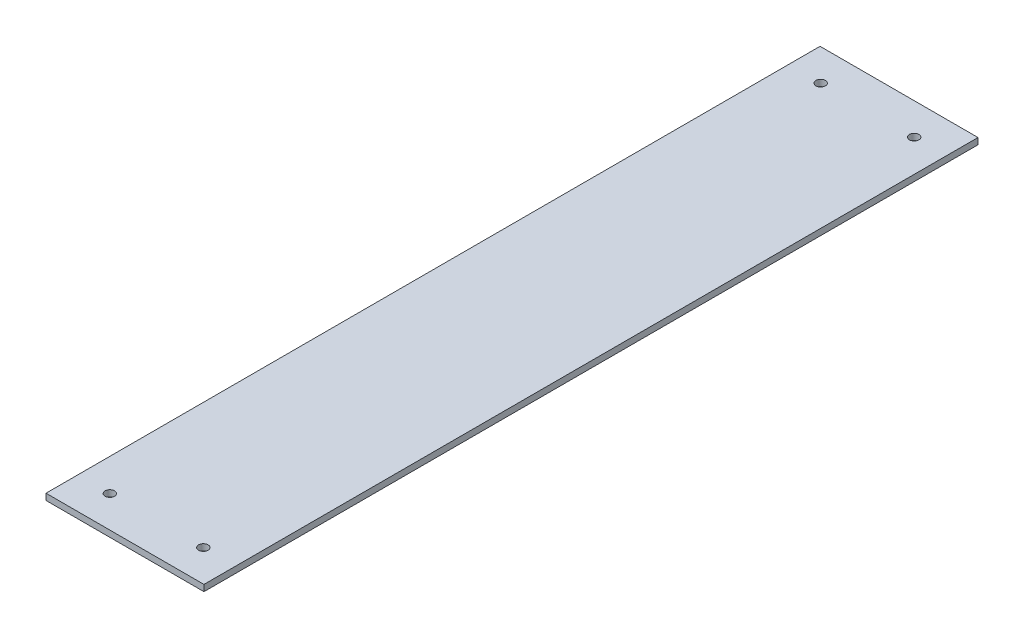
ISO-10303-21;
HEADER;
FILE_DESCRIPTION(('STEP AP214'),'2;1');
FILE_NAME('part.step','',(''),(''),'','','');
FILE_SCHEMA(('AUTOMOTIVE_DESIGN { 1 0 10303 214 1 1 1 1 }'));
ENDSEC;
DATA;
#1=APPLICATION_CONTEXT('core data for automotive mechanical design processes');
#2=APPLICATION_PROTOCOL_DEFINITION('international standard','automotive_design',2000,#1);
#3=PRODUCT_CONTEXT('',#1,'mechanical');
#4=PRODUCT('Part','Part','',(#3));
#5=PRODUCT_RELATED_PRODUCT_CATEGORY('part','',(#4));
#6=PRODUCT_DEFINITION_FORMATION('','',#4);
#7=PRODUCT_DEFINITION_CONTEXT('part definition',#1,'design');
#8=PRODUCT_DEFINITION('design','',#6,#7);
#9=PRODUCT_DEFINITION_SHAPE('','',#8);
#10=(LENGTH_UNIT() NAMED_UNIT(*) SI_UNIT(.MILLI.,.METRE.));
#11=(NAMED_UNIT(*) PLANE_ANGLE_UNIT() SI_UNIT($,.RADIAN.));
#12=(NAMED_UNIT(*) SI_UNIT($,.STERADIAN.) SOLID_ANGLE_UNIT());
#13=UNCERTAINTY_MEASURE_WITH_UNIT(LENGTH_MEASURE(1.E-05),#10,'distance_accuracy_value','');
#14=(GEOMETRIC_REPRESENTATION_CONTEXT(3) GLOBAL_UNCERTAINTY_ASSIGNED_CONTEXT((#13)) GLOBAL_UNIT_ASSIGNED_CONTEXT((#10,
#11,#12)) REPRESENTATION_CONTEXT('',''));
#15=CARTESIAN_POINT('',(0.,0.,0.));
#16=DIRECTION('',(0.,0.,1.));
#17=DIRECTION('',(1.,0.,0.));
#18=AXIS2_PLACEMENT_3D('',#15,#16,#17);
#19=CARTESIAN_POINT('',(0.,2.,0.));
#20=DIRECTION('',(0.,-1.,0.));
#21=DIRECTION('',(0.,0.,-1.));
#22=AXIS2_PLACEMENT_3D('',#19,#20,#21);
#23=PLANE('',#22);
#24=DIRECTION('',(0.,0.,1.));
#25=VECTOR('',#24,1.);
#26=CARTESIAN_POINT('',(0.,2.,0.));
#27=LINE('',#26,#25);
#28=CARTESIAN_POINT('',(0.,2.,-245.));
#29=VERTEX_POINT('',#28);
#30=CARTESIAN_POINT('',(0.,2.,0.));
#31=VERTEX_POINT('',#30);
#32=EDGE_CURVE('E88',#29,#31,#27,.T.);
#33=ORIENTED_EDGE('',*,*,#32,.T.);
#34=DIRECTION('',(1.,0.,0.));
#35=VECTOR('',#34,1.);
#36=CARTESIAN_POINT('',(0.,2.,0.));
#37=LINE('',#36,#35);
#38=CARTESIAN_POINT('',(50.,2.,0.));
#39=VERTEX_POINT('',#38);
#40=EDGE_CURVE('E83',#31,#39,#37,.T.);
#41=ORIENTED_EDGE('',*,*,#40,.T.);
#42=DIRECTION('',(0.,0.,-1.));
#43=VECTOR('',#42,1.);
#44=CARTESIAN_POINT('',(50.,2.,0.));
#45=LINE('',#44,#43);
#46=CARTESIAN_POINT('',(50.,2.,-245.));
#47=VERTEX_POINT('',#46);
#48=EDGE_CURVE('E86',#39,#47,#45,.T.);
#49=ORIENTED_EDGE('',*,*,#48,.T.);
#50=DIRECTION('',(-1.,0.,0.));
#51=VECTOR('',#50,1.);
#52=CARTESIAN_POINT('',(0.,2.,-245.));
#53=LINE('',#52,#51);
#54=EDGE_CURVE('E53',#47,#29,#53,.T.);
#55=ORIENTED_EDGE('',*,*,#54,.T.);
#56=EDGE_LOOP('',(#33,#41,#49,#55));
#57=FACE_BOUND('',#56,.T.);
#58=CARTESIAN_POINT('',(39.8,2.,-10.));
#59=DIRECTION('',(0.,1.,0.));
#60=DIRECTION('',(0.,0.,1.));
#61=AXIS2_PLACEMENT_3D('',#58,#59,#60);
#62=CIRCLE('',#61,1.5);
#63=CARTESIAN_POINT('',(39.8,2.,-8.5));
#64=VERTEX_POINT('',#63);
#65=EDGE_CURVE('E103',#64,#64,#62,.T.);
#66=ORIENTED_EDGE('',*,*,#65,.F.);
#67=EDGE_LOOP('',(#66));
#68=FACE_BOUND('',#67,.T.);
#69=CARTESIAN_POINT('',(10.2,2.,-10.));
#70=DIRECTION('',(0.,1.,0.));
#71=DIRECTION('',(0.,0.,1.));
#72=AXIS2_PLACEMENT_3D('',#69,#70,#71);
#73=CIRCLE('',#72,1.5);
#74=CARTESIAN_POINT('',(10.2,2.,-8.5));
#75=VERTEX_POINT('',#74);
#76=EDGE_CURVE('E118',#75,#75,#73,.T.);
#77=ORIENTED_EDGE('',*,*,#76,.F.);
#78=EDGE_LOOP('',(#77));
#79=FACE_BOUND('',#78,.T.);
#80=CARTESIAN_POINT('',(39.8,2.,-235.));
#81=DIRECTION('',(0.,1.,0.));
#82=DIRECTION('',(0.,0.,-1.));
#83=AXIS2_PLACEMENT_3D('',#80,#81,#82);
#84=CIRCLE('',#83,1.49999999999999);
#85=CARTESIAN_POINT('',(39.8,2.,-236.5));
#86=VERTEX_POINT('',#85);
#87=EDGE_CURVE('E124',#86,#86,#84,.T.);
#88=ORIENTED_EDGE('',*,*,#87,.F.);
#89=EDGE_LOOP('',(#88));
#90=FACE_BOUND('',#89,.T.);
#91=CARTESIAN_POINT('',(10.2,2.,-235.));
#92=DIRECTION('',(0.,1.,0.));
#93=DIRECTION('',(0.,0.,-1.));
#94=AXIS2_PLACEMENT_3D('',#91,#92,#93);
#95=CIRCLE('',#94,1.5);
#96=CARTESIAN_POINT('',(10.2,2.,-236.5));
#97=VERTEX_POINT('',#96);
#98=EDGE_CURVE('E130',#97,#97,#95,.T.);
#99=ORIENTED_EDGE('',*,*,#98,.F.);
#100=EDGE_LOOP('',(#99));
#101=FACE_BOUND('',#100,.T.);
#102=ADVANCED_FACE('F36',(#57,#68,#79,#90,#101),#23,.F.);
#103=CARTESIAN_POINT('',(0.,0.,0.));
#104=DIRECTION('',(0.,-1.,0.));
#105=DIRECTION('',(0.,0.,-1.));
#106=AXIS2_PLACEMENT_3D('',#103,#104,#105);
#107=PLANE('',#106);
#108=CARTESIAN_POINT('',(39.8,0.,-235.));
#109=DIRECTION('',(0.,1.,0.));
#110=DIRECTION('',(0.,0.,-1.));
#111=AXIS2_PLACEMENT_3D('',#108,#109,#110);
#112=CIRCLE('',#111,1.49999999999999);
#113=CARTESIAN_POINT('',(39.8,0.,-236.5));
#114=VERTEX_POINT('',#113);
#115=EDGE_CURVE('E127',#114,#114,#112,.T.);
#116=ORIENTED_EDGE('',*,*,#115,.T.);
#117=EDGE_LOOP('',(#116));
#118=FACE_BOUND('',#117,.T.);
#119=CARTESIAN_POINT('',(39.8,0.,-10.));
#120=DIRECTION('',(0.,1.,0.));
#121=DIRECTION('',(0.,0.,1.));
#122=AXIS2_PLACEMENT_3D('',#119,#120,#121);
#123=CIRCLE('',#122,1.5);
#124=CARTESIAN_POINT('',(39.8,0.,-8.5));
#125=VERTEX_POINT('',#124);
#126=EDGE_CURVE('E115',#125,#125,#123,.T.);
#127=ORIENTED_EDGE('',*,*,#126,.T.);
#128=EDGE_LOOP('',(#127));
#129=FACE_BOUND('',#128,.T.);
#130=DIRECTION('',(0.,0.,1.));
#131=VECTOR('',#130,1.);
#132=CARTESIAN_POINT('',(0.,0.,0.));
#133=LINE('',#132,#131);
#134=CARTESIAN_POINT('',(0.,0.,-245.));
#135=VERTEX_POINT('',#134);
#136=CARTESIAN_POINT('',(0.,0.,0.));
#137=VERTEX_POINT('',#136);
#138=EDGE_CURVE('E100',#135,#137,#133,.T.);
#139=ORIENTED_EDGE('',*,*,#138,.F.);
#140=DIRECTION('',(-1.,0.,0.));
#141=VECTOR('',#140,1.);
#142=CARTESIAN_POINT('',(0.,0.,-245.));
#143=LINE('',#142,#141);
#144=CARTESIAN_POINT('',(50.,0.,-245.));
#145=VERTEX_POINT('',#144);
#146=EDGE_CURVE('E76',#145,#135,#143,.T.);
#147=ORIENTED_EDGE('',*,*,#146,.F.);
#148=DIRECTION('',(0.,0.,-1.));
#149=VECTOR('',#148,1.);
#150=CARTESIAN_POINT('',(50.,0.,0.));
#151=LINE('',#150,#149);
#152=CARTESIAN_POINT('',(50.,0.,0.));
#153=VERTEX_POINT('',#152);
#154=EDGE_CURVE('E70',#153,#145,#151,.T.);
#155=ORIENTED_EDGE('',*,*,#154,.F.);
#156=DIRECTION('',(1.,0.,0.));
#157=VECTOR('',#156,1.);
#158=CARTESIAN_POINT('',(0.,0.,0.));
#159=LINE('',#158,#157);
#160=EDGE_CURVE('E92',#137,#153,#159,.T.);
#161=ORIENTED_EDGE('',*,*,#160,.F.);
#162=EDGE_LOOP('',(#139,#147,#155,#161));
#163=FACE_BOUND('',#162,.T.);
#164=CARTESIAN_POINT('',(10.2,0.,-10.));
#165=DIRECTION('',(0.,1.,0.));
#166=DIRECTION('',(0.,0.,1.));
#167=AXIS2_PLACEMENT_3D('',#164,#165,#166);
#168=CIRCLE('',#167,1.5);
#169=CARTESIAN_POINT('',(10.2,0.,-8.5));
#170=VERTEX_POINT('',#169);
#171=EDGE_CURVE('E121',#170,#170,#168,.T.);
#172=ORIENTED_EDGE('',*,*,#171,.T.);
#173=EDGE_LOOP('',(#172));
#174=FACE_BOUND('',#173,.T.);
#175=CARTESIAN_POINT('',(10.2,0.,-235.));
#176=DIRECTION('',(0.,1.,0.));
#177=DIRECTION('',(0.,0.,-1.));
#178=AXIS2_PLACEMENT_3D('',#175,#176,#177);
#179=CIRCLE('',#178,1.5);
#180=CARTESIAN_POINT('',(10.2,0.,-236.5));
#181=VERTEX_POINT('',#180);
#182=EDGE_CURVE('E133',#181,#181,#179,.T.);
#183=ORIENTED_EDGE('',*,*,#182,.T.);
#184=EDGE_LOOP('',(#183));
#185=FACE_BOUND('',#184,.T.);
#186=ADVANCED_FACE('F111',(#118,#129,#163,#174,#185),#107,.T.);
#187=CARTESIAN_POINT('',(0.,2.,0.));
#188=DIRECTION('',(1.,0.,0.));
#189=DIRECTION('',(0.,0.,-1.));
#190=AXIS2_PLACEMENT_3D('',#187,#188,#189);
#191=PLANE('',#190);
#192=ORIENTED_EDGE('',*,*,#138,.T.);
#193=DIRECTION('',(0.,-1.,0.));
#194=VECTOR('',#193,1.);
#195=CARTESIAN_POINT('',(0.,2.,0.));
#196=LINE('',#195,#194);
#197=EDGE_CURVE('E11',#31,#137,#196,.T.);
#198=ORIENTED_EDGE('',*,*,#197,.F.);
#199=ORIENTED_EDGE('',*,*,#32,.F.);
#200=DIRECTION('',(0.,-1.,0.));
#201=VECTOR('',#200,1.);
#202=CARTESIAN_POINT('',(0.,2.,-245.));
#203=LINE('',#202,#201);
#204=EDGE_CURVE('E96',#29,#135,#203,.T.);
#205=ORIENTED_EDGE('',*,*,#204,.T.);
#206=EDGE_LOOP('',(#192,#198,#199,#205));
#207=FACE_BOUND('',#206,.T.);
#208=ADVANCED_FACE('F38',(#207),#191,.F.);
#209=CARTESIAN_POINT('',(0.,2.,0.));
#210=DIRECTION('',(0.,0.,-1.));
#211=DIRECTION('',(-1.,0.,0.));
#212=AXIS2_PLACEMENT_3D('',#209,#210,#211);
#213=PLANE('',#212);
#214=ORIENTED_EDGE('',*,*,#160,.T.);
#215=DIRECTION('',(0.,-1.,0.));
#216=VECTOR('',#215,1.);
#217=CARTESIAN_POINT('',(50.,2.,0.));
#218=LINE('',#217,#216);
#219=EDGE_CURVE('E45',#39,#153,#218,.T.);
#220=ORIENTED_EDGE('',*,*,#219,.F.);
#221=ORIENTED_EDGE('',*,*,#40,.F.);
#222=ORIENTED_EDGE('',*,*,#197,.T.);
#223=EDGE_LOOP('',(#214,#220,#221,#222));
#224=FACE_BOUND('',#223,.T.);
#225=ADVANCED_FACE('F91',(#224),#213,.F.);
#226=CARTESIAN_POINT('',(50.,2.,0.));
#227=DIRECTION('',(-1.,0.,0.));
#228=DIRECTION('',(0.,0.,1.));
#229=AXIS2_PLACEMENT_3D('',#226,#227,#228);
#230=PLANE('',#229);
#231=ORIENTED_EDGE('',*,*,#154,.T.);
#232=DIRECTION('',(0.,-1.,0.));
#233=VECTOR('',#232,1.);
#234=CARTESIAN_POINT('',(50.,2.,-245.));
#235=LINE('',#234,#233);
#236=EDGE_CURVE('E93',#47,#145,#235,.T.);
#237=ORIENTED_EDGE('',*,*,#236,.F.);
#238=ORIENTED_EDGE('',*,*,#48,.F.);
#239=ORIENTED_EDGE('',*,*,#219,.T.);
#240=EDGE_LOOP('',(#231,#237,#238,#239));
#241=FACE_BOUND('',#240,.T.);
#242=ADVANCED_FACE('F94',(#241),#230,.F.);
#243=CARTESIAN_POINT('',(0.,2.,-245.));
#244=DIRECTION('',(0.,0.,1.));
#245=DIRECTION('',(1.,0.,0.));
#246=AXIS2_PLACEMENT_3D('',#243,#244,#245);
#247=PLANE('',#246);
#248=ORIENTED_EDGE('',*,*,#146,.T.);
#249=ORIENTED_EDGE('',*,*,#204,.F.);
#250=ORIENTED_EDGE('',*,*,#54,.F.);
#251=ORIENTED_EDGE('',*,*,#236,.T.);
#252=EDGE_LOOP('',(#248,#249,#250,#251));
#253=FACE_BOUND('',#252,.T.);
#254=ADVANCED_FACE('F108',(#253),#247,.F.);
#255=CARTESIAN_POINT('',(39.8,2.,-10.));
#256=DIRECTION('',(0.,-1.,0.));
#257=DIRECTION('',(0.,0.,-1.));
#258=AXIS2_PLACEMENT_3D('',#255,#256,#257);
#259=CYLINDRICAL_SURFACE('',#258,1.5);
#260=ORIENTED_EDGE('',*,*,#65,.T.);
#261=EDGE_LOOP('',(#260));
#262=FACE_BOUND('',#261,.T.);
#263=ORIENTED_EDGE('',*,*,#126,.F.);
#264=EDGE_LOOP('',(#263));
#265=FACE_BOUND('',#264,.T.);
#266=ADVANCED_FACE('F150',(#262,#265),#259,.F.);
#267=CARTESIAN_POINT('',(10.2,2.,-10.));
#268=DIRECTION('',(0.,-1.,0.));
#269=DIRECTION('',(0.,0.,-1.));
#270=AXIS2_PLACEMENT_3D('',#267,#268,#269);
#271=CYLINDRICAL_SURFACE('',#270,1.5);
#272=ORIENTED_EDGE('',*,*,#76,.T.);
#273=EDGE_LOOP('',(#272));
#274=FACE_BOUND('',#273,.T.);
#275=ORIENTED_EDGE('',*,*,#171,.F.);
#276=EDGE_LOOP('',(#275));
#277=FACE_BOUND('',#276,.T.);
#278=ADVANCED_FACE('F198',(#274,#277),#271,.F.);
#279=CARTESIAN_POINT('',(39.8,2.,-235.));
#280=DIRECTION('',(0.,-1.,0.));
#281=DIRECTION('',(0.,0.,-1.));
#282=AXIS2_PLACEMENT_3D('',#279,#280,#281);
#283=CYLINDRICAL_SURFACE('',#282,1.49999999999999);
#284=ORIENTED_EDGE('',*,*,#87,.T.);
#285=EDGE_LOOP('',(#284));
#286=FACE_BOUND('',#285,.T.);
#287=ORIENTED_EDGE('',*,*,#115,.F.);
#288=EDGE_LOOP('',(#287));
#289=FACE_BOUND('',#288,.T.);
#290=ADVANCED_FACE('F206',(#286,#289),#283,.F.);
#291=CARTESIAN_POINT('',(10.2,2.,-235.));
#292=DIRECTION('',(0.,-1.,0.));
#293=DIRECTION('',(0.,0.,-1.));
#294=AXIS2_PLACEMENT_3D('',#291,#292,#293);
#295=CYLINDRICAL_SURFACE('',#294,1.5);
#296=ORIENTED_EDGE('',*,*,#98,.T.);
#297=EDGE_LOOP('',(#296));
#298=FACE_BOUND('',#297,.T.);
#299=ORIENTED_EDGE('',*,*,#182,.F.);
#300=EDGE_LOOP('',(#299));
#301=FACE_BOUND('',#300,.T.);
#302=ADVANCED_FACE('F139',(#298,#301),#295,.F.);
#303=CLOSED_SHELL('',(#102,#186,#208,#225,#242,#254,#266,#278,#290,#302));
#304=MANIFOLD_SOLID_BREP('B2',#303);
#305=ADVANCED_BREP_SHAPE_REPRESENTATION('',(#18,#304),#14);
#306=SHAPE_DEFINITION_REPRESENTATION(#9,#305);
ENDSEC;
END-ISO-10303-21;
